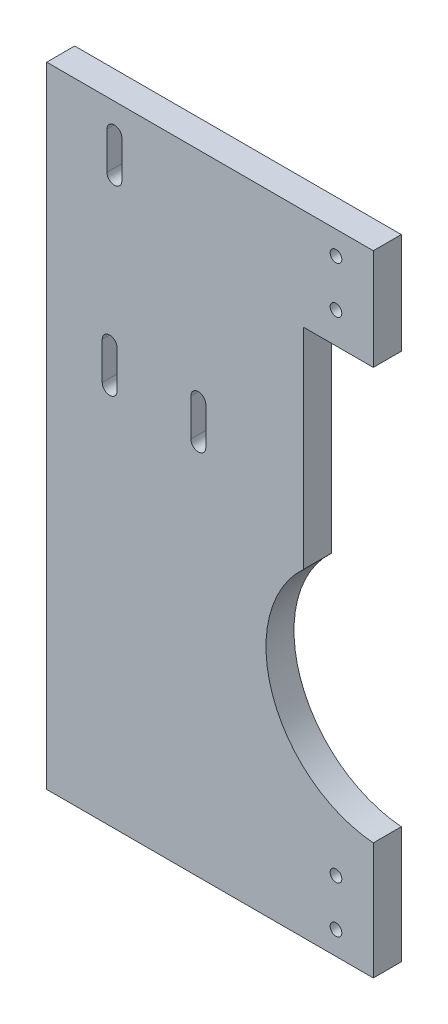
ISO-10303-21;
HEADER;
FILE_DESCRIPTION(('STEP AP214'),'2;1');
FILE_NAME('part.step','',(''),(''),'','','');
FILE_SCHEMA(('AUTOMOTIVE_DESIGN { 1 0 10303 214 1 1 1 1 }'));
ENDSEC;
DATA;
#1=APPLICATION_CONTEXT('core data for automotive mechanical design processes');
#2=APPLICATION_PROTOCOL_DEFINITION('international standard','automotive_design',2000,#1);
#3=PRODUCT_CONTEXT('',#1,'mechanical');
#4=PRODUCT('Part','Part','',(#3));
#5=PRODUCT_RELATED_PRODUCT_CATEGORY('part','',(#4));
#6=PRODUCT_DEFINITION_FORMATION('','',#4);
#7=PRODUCT_DEFINITION_CONTEXT('part definition',#1,'design');
#8=PRODUCT_DEFINITION('design','',#6,#7);
#9=PRODUCT_DEFINITION_SHAPE('','',#8);
#10=(LENGTH_UNIT() NAMED_UNIT(*) SI_UNIT(.MILLI.,.METRE.));
#11=(NAMED_UNIT(*) PLANE_ANGLE_UNIT() SI_UNIT($,.RADIAN.));
#12=(NAMED_UNIT(*) SI_UNIT($,.STERADIAN.) SOLID_ANGLE_UNIT());
#13=UNCERTAINTY_MEASURE_WITH_UNIT(LENGTH_MEASURE(1.E-05),#10,'distance_accuracy_value','');
#14=(GEOMETRIC_REPRESENTATION_CONTEXT(3) GLOBAL_UNCERTAINTY_ASSIGNED_CONTEXT((#13)) GLOBAL_UNIT_ASSIGNED_CONTEXT((#10,
#11,#12)) REPRESENTATION_CONTEXT('',''));
#15=CARTESIAN_POINT('',(0.,0.,0.));
#16=DIRECTION('',(0.,0.,1.));
#17=DIRECTION('',(1.,0.,0.));
#18=AXIS2_PLACEMENT_3D('',#15,#16,#17);
#19=CARTESIAN_POINT('',(70.,0.,6.));
#20=DIRECTION('',(-1.,0.,0.));
#21=DIRECTION('',(0.,0.,1.));
#22=AXIS2_PLACEMENT_3D('',#19,#20,#21);
#23=PLANE('',#22);
#24=DIRECTION('',(0.,1.,0.));
#25=VECTOR('',#24,1.);
#26=CARTESIAN_POINT('',(70.,0.,0.));
#27=LINE('',#26,#25);
#28=CARTESIAN_POINT('',(70.,0.,0.));
#29=VERTEX_POINT('',#28);
#30=CARTESIAN_POINT('',(70.,25.0801284112458,0.));
#31=VERTEX_POINT('',#30);
#32=EDGE_CURVE('E354',#29,#31,#27,.T.);
#33=ORIENTED_EDGE('',*,*,#32,.T.);
#34=DIRECTION('',(0.,0.,1.));
#35=VECTOR('',#34,1.);
#36=CARTESIAN_POINT('',(70.,25.0801284112458,0.));
#37=LINE('',#36,#35);
#38=CARTESIAN_POINT('',(70.,25.0801284112458,6.));
#39=VERTEX_POINT('',#38);
#40=EDGE_CURVE('E380',#31,#39,#37,.T.);
#41=ORIENTED_EDGE('',*,*,#40,.T.);
#42=DIRECTION('',(0.,1.,0.));
#43=VECTOR('',#42,1.);
#44=CARTESIAN_POINT('',(70.,0.,6.));
#45=LINE('',#44,#43);
#46=CARTESIAN_POINT('',(70.,0.,6.));
#47=VERTEX_POINT('',#46);
#48=EDGE_CURVE('E440',#47,#39,#45,.T.);
#49=ORIENTED_EDGE('',*,*,#48,.F.);
#50=DIRECTION('',(0.,0.,-1.));
#51=VECTOR('',#50,1.);
#52=CARTESIAN_POINT('',(70.,0.,6.));
#53=LINE('',#52,#51);
#54=EDGE_CURVE('E496',#47,#29,#53,.T.);
#55=ORIENTED_EDGE('',*,*,#54,.T.);
#56=EDGE_LOOP('',(#33,#41,#49,#55));
#57=FACE_BOUND('',#56,.T.);
#58=ADVANCED_FACE('F38',(#57),#23,.F.);
#59=CARTESIAN_POINT('',(0.,0.,6.));
#60=DIRECTION('',(0.,0.,-1.));
#61=DIRECTION('',(-1.,0.,0.));
#62=AXIS2_PLACEMENT_3D('',#59,#60,#61);
#63=PLANE('',#62);
#64=DIRECTION('',(0.,1.,0.));
#65=VECTOR('',#64,1.);
#66=CARTESIAN_POINT('',(30.9,88.5,6.));
#67=LINE('',#66,#65);
#68=CARTESIAN_POINT('',(30.9,80.5,6.));
#69=VERTEX_POINT('',#68);
#70=CARTESIAN_POINT('',(30.9,88.5,6.));
#71=VERTEX_POINT('',#70);
#72=EDGE_CURVE('E183',#69,#71,#67,.T.);
#73=ORIENTED_EDGE('',*,*,#72,.T.);
#74=CARTESIAN_POINT('',(32.5,88.5,6.));
#75=DIRECTION('',(0.,0.,-1.));
#76=DIRECTION('',(-1.,0.,0.));
#77=AXIS2_PLACEMENT_3D('',#74,#75,#76);
#78=CIRCLE('',#77,1.6);
#79=CARTESIAN_POINT('',(34.1,88.5,6.));
#80=VERTEX_POINT('',#79);
#81=EDGE_CURVE('E177',#71,#80,#78,.T.);
#82=ORIENTED_EDGE('',*,*,#81,.T.);
#83=DIRECTION('',(0.,-1.,0.));
#84=VECTOR('',#83,1.);
#85=CARTESIAN_POINT('',(34.1,88.5,6.));
#86=LINE('',#85,#84);
#87=CARTESIAN_POINT('',(34.1,80.5,6.));
#88=VERTEX_POINT('',#87);
#89=EDGE_CURVE('E186',#80,#88,#86,.T.);
#90=ORIENTED_EDGE('',*,*,#89,.T.);
#91=CARTESIAN_POINT('',(32.5,80.5,6.));
#92=DIRECTION('',(0.,0.,-1.));
#93=DIRECTION('',(-1.,0.,0.));
#94=AXIS2_PLACEMENT_3D('',#91,#92,#93);
#95=CIRCLE('',#94,1.6);
#96=EDGE_CURVE('E53',#88,#69,#95,.T.);
#97=ORIENTED_EDGE('',*,*,#96,.T.);
#98=EDGE_LOOP('',(#73,#82,#90,#97));
#99=FACE_BOUND('',#98,.T.);
#100=DIRECTION('',(0.,1.,0.));
#101=VECTOR('',#100,1.);
#102=CARTESIAN_POINT('',(11.9,89.5,6.));
#103=LINE('',#102,#101);
#104=CARTESIAN_POINT('',(11.9,81.5,6.));
#105=VERTEX_POINT('',#104);
#106=CARTESIAN_POINT('',(11.9,89.5,6.));
#107=VERTEX_POINT('',#106);
#108=EDGE_CURVE('E257',#105,#107,#103,.T.);
#109=ORIENTED_EDGE('',*,*,#108,.T.);
#110=CARTESIAN_POINT('',(13.5,89.5,6.));
#111=DIRECTION('',(0.,0.,-1.));
#112=DIRECTION('',(-1.,0.,0.));
#113=AXIS2_PLACEMENT_3D('',#110,#111,#112);
#114=CIRCLE('',#113,1.6);
#115=CARTESIAN_POINT('',(15.1,89.5,6.));
#116=VERTEX_POINT('',#115);
#117=EDGE_CURVE('E239',#107,#116,#114,.T.);
#118=ORIENTED_EDGE('',*,*,#117,.T.);
#119=DIRECTION('',(0.,-1.,0.));
#120=VECTOR('',#119,1.);
#121=CARTESIAN_POINT('',(15.1,89.5,6.));
#122=LINE('',#121,#120);
#123=CARTESIAN_POINT('',(15.1,81.5,6.));
#124=VERTEX_POINT('',#123);
#125=EDGE_CURVE('E244',#116,#124,#122,.T.);
#126=ORIENTED_EDGE('',*,*,#125,.T.);
#127=CARTESIAN_POINT('',(13.5,81.5,6.));
#128=DIRECTION('',(0.,0.,-1.));
#129=DIRECTION('',(-1.,0.,0.));
#130=AXIS2_PLACEMENT_3D('',#127,#128,#129);
#131=CIRCLE('',#130,1.6);
#132=EDGE_CURVE('E253',#124,#105,#131,.T.);
#133=ORIENTED_EDGE('',*,*,#132,.T.);
#134=EDGE_LOOP('',(#109,#118,#126,#133));
#135=FACE_BOUND('',#134,.T.);
#136=DIRECTION('',(0.,1.,0.));
#137=VECTOR('',#136,1.);
#138=CARTESIAN_POINT('',(12.9,129.,6.));
#139=LINE('',#138,#137);
#140=CARTESIAN_POINT('',(12.9,121.,6.));
#141=VERTEX_POINT('',#140);
#142=CARTESIAN_POINT('',(12.9,129.,6.));
#143=VERTEX_POINT('',#142);
#144=EDGE_CURVE('E307',#141,#143,#139,.T.);
#145=ORIENTED_EDGE('',*,*,#144,.T.);
#146=CARTESIAN_POINT('',(14.5,129.,6.));
#147=DIRECTION('',(0.,0.,-1.));
#148=DIRECTION('',(-1.,0.,0.));
#149=AXIS2_PLACEMENT_3D('',#146,#147,#148);
#150=CIRCLE('',#149,1.6);
#151=CARTESIAN_POINT('',(16.1,129.,6.));
#152=VERTEX_POINT('',#151);
#153=EDGE_CURVE('E289',#143,#152,#150,.T.);
#154=ORIENTED_EDGE('',*,*,#153,.T.);
#155=DIRECTION('',(0.,-1.,0.));
#156=VECTOR('',#155,1.);
#157=CARTESIAN_POINT('',(16.1,129.,6.));
#158=LINE('',#157,#156);
#159=CARTESIAN_POINT('',(16.1,121.,6.));
#160=VERTEX_POINT('',#159);
#161=EDGE_CURVE('E294',#152,#160,#158,.T.);
#162=ORIENTED_EDGE('',*,*,#161,.T.);
#163=CARTESIAN_POINT('',(14.5,121.,6.));
#164=DIRECTION('',(0.,0.,-1.));
#165=DIRECTION('',(-1.,0.,0.));
#166=AXIS2_PLACEMENT_3D('',#163,#164,#165);
#167=CIRCLE('',#166,1.6);
#168=EDGE_CURVE('E303',#160,#141,#167,.T.);
#169=ORIENTED_EDGE('',*,*,#168,.T.);
#170=EDGE_LOOP('',(#145,#154,#162,#169));
#171=FACE_BOUND('',#170,.T.);
#172=CARTESIAN_POINT('',(62.,120.,6.));
#173=DIRECTION('',(0.,0.,1.));
#174=DIRECTION('',(-1.,0.,0.));
#175=AXIS2_PLACEMENT_3D('',#172,#173,#174);
#176=CIRCLE('',#175,1.24999999999998);
#177=CARTESIAN_POINT('',(60.75,120.,6.));
#178=VERTEX_POINT('',#177);
#179=EDGE_CURVE('E413',#178,#178,#176,.T.);
#180=ORIENTED_EDGE('',*,*,#179,.F.);
#181=EDGE_LOOP('',(#180));
#182=FACE_BOUND('',#181,.T.);
#183=CARTESIAN_POINT('',(62.,5.,6.));
#184=DIRECTION('',(0.,0.,1.));
#185=DIRECTION('',(1.,0.,0.));
#186=AXIS2_PLACEMENT_3D('',#183,#184,#185);
#187=CIRCLE('',#186,1.24999999999999);
#188=CARTESIAN_POINT('',(63.25,5.,6.));
#189=VERTEX_POINT('',#188);
#190=EDGE_CURVE('E450',#189,#189,#187,.T.);
#191=ORIENTED_EDGE('',*,*,#190,.F.);
#192=EDGE_LOOP('',(#191));
#193=FACE_BOUND('',#192,.T.);
#194=ORIENTED_EDGE('',*,*,#48,.T.);
#195=CARTESIAN_POINT('',(72.,50.,6.));
#196=DIRECTION('',(0.,0.,1.));
#197=DIRECTION('',(-1.,0.,0.));
#198=AXIS2_PLACEMENT_3D('',#195,#196,#197);
#199=CIRCLE('',#198,25.);
#200=CARTESIAN_POINT('',(55.,68.3303027798234,6.));
#201=VERTEX_POINT('',#200);
#202=EDGE_CURVE('E332',#201,#39,#199,.T.);
#203=ORIENTED_EDGE('',*,*,#202,.F.);
#204=DIRECTION('',(0.,-1.,0.));
#205=VECTOR('',#204,1.);
#206=CARTESIAN_POINT('',(55.,113.330302779823,6.));
#207=LINE('',#206,#205);
#208=CARTESIAN_POINT('',(55.,113.330302779823,6.));
#209=VERTEX_POINT('',#208);
#210=EDGE_CURVE('E345',#209,#201,#207,.T.);
#211=ORIENTED_EDGE('',*,*,#210,.F.);
#212=DIRECTION('',(-1.,0.,0.));
#213=VECTOR('',#212,1.);
#214=CARTESIAN_POINT('',(70.,113.330302779823,6.));
#215=LINE('',#214,#213);
#216=CARTESIAN_POINT('',(70.,113.330302779823,6.));
#217=VERTEX_POINT('',#216);
#218=EDGE_CURVE('E384',#217,#209,#215,.T.);
#219=ORIENTED_EDGE('',*,*,#218,.F.);
#220=CARTESIAN_POINT('',(70.,135.,6.));
#221=VERTEX_POINT('',#220);
#222=EDGE_CURVE('E445',#217,#221,#45,.T.);
#223=ORIENTED_EDGE('',*,*,#222,.T.);
#224=DIRECTION('',(-1.,0.,0.));
#225=VECTOR('',#224,1.);
#226=CARTESIAN_POINT('',(0.,135.,6.));
#227=LINE('',#226,#225);
#228=CARTESIAN_POINT('',(0.,135.,6.));
#229=VERTEX_POINT('',#228);
#230=EDGE_CURVE('E437',#221,#229,#227,.T.);
#231=ORIENTED_EDGE('',*,*,#230,.T.);
#232=DIRECTION('',(0.,-1.,0.));
#233=VECTOR('',#232,1.);
#234=CARTESIAN_POINT('',(0.,0.,6.));
#235=LINE('',#234,#233);
#236=CARTESIAN_POINT('',(0.,0.,6.));
#237=VERTEX_POINT('',#236);
#238=EDGE_CURVE('E434',#229,#237,#235,.T.);
#239=ORIENTED_EDGE('',*,*,#238,.T.);
#240=DIRECTION('',(1.,0.,0.));
#241=VECTOR('',#240,1.);
#242=CARTESIAN_POINT('',(0.,0.,6.));
#243=LINE('',#242,#241);
#244=EDGE_CURVE('E362',#237,#47,#243,.T.);
#245=ORIENTED_EDGE('',*,*,#244,.T.);
#246=EDGE_LOOP('',(#194,#203,#211,#219,#223,#231,#239,#245));
#247=FACE_BOUND('',#246,.T.);
#248=CARTESIAN_POINT('',(62.,15.,6.));
#249=DIRECTION('',(0.,0.,1.));
#250=DIRECTION('',(1.,0.,0.));
#251=AXIS2_PLACEMENT_3D('',#248,#249,#250);
#252=CIRCLE('',#251,1.24999999999998);
#253=CARTESIAN_POINT('',(63.25,15.,6.));
#254=VERTEX_POINT('',#253);
#255=EDGE_CURVE('E422',#254,#254,#252,.T.);
#256=ORIENTED_EDGE('',*,*,#255,.F.);
#257=EDGE_LOOP('',(#256));
#258=FACE_BOUND('',#257,.T.);
#259=CARTESIAN_POINT('',(62.,130.,6.));
#260=DIRECTION('',(0.,0.,1.));
#261=DIRECTION('',(-1.,0.,0.));
#262=AXIS2_PLACEMENT_3D('',#259,#260,#261);
#263=CIRCLE('',#262,1.24999999999999);
#264=CARTESIAN_POINT('',(60.75,130.,6.));
#265=VERTEX_POINT('',#264);
#266=EDGE_CURVE('E405',#265,#265,#263,.T.);
#267=ORIENTED_EDGE('',*,*,#266,.F.);
#268=EDGE_LOOP('',(#267));
#269=FACE_BOUND('',#268,.T.);
#270=ADVANCED_FACE('F191',(#99,#135,#171,#182,#193,#247,#258,#269),#63,.F.);
#271=CARTESIAN_POINT('',(0.,0.,0.));
#272=DIRECTION('',(0.,0.,-1.));
#273=DIRECTION('',(-1.,0.,0.));
#274=AXIS2_PLACEMENT_3D('',#271,#272,#273);
#275=PLANE('',#274);
#276=CARTESIAN_POINT('',(32.5,88.5,0.));
#277=DIRECTION('',(0.,0.,-1.));
#278=DIRECTION('',(-1.,0.,0.));
#279=AXIS2_PLACEMENT_3D('',#276,#277,#278);
#280=CIRCLE('',#279,1.6);
#281=CARTESIAN_POINT('',(30.9,88.5,0.));
#282=VERTEX_POINT('',#281);
#283=CARTESIAN_POINT('',(34.1,88.5,0.));
#284=VERTEX_POINT('',#283);
#285=EDGE_CURVE('E61',#282,#284,#280,.T.);
#286=ORIENTED_EDGE('',*,*,#285,.F.);
#287=DIRECTION('',(0.,1.,0.));
#288=VECTOR('',#287,1.);
#289=CARTESIAN_POINT('',(30.9,88.5,0.));
#290=LINE('',#289,#288);
#291=CARTESIAN_POINT('',(30.9,80.5,0.));
#292=VERTEX_POINT('',#291);
#293=EDGE_CURVE('E195',#292,#282,#290,.T.);
#294=ORIENTED_EDGE('',*,*,#293,.F.);
#295=CARTESIAN_POINT('',(32.5,80.5,0.));
#296=DIRECTION('',(0.,0.,-1.));
#297=DIRECTION('',(-1.,0.,0.));
#298=AXIS2_PLACEMENT_3D('',#295,#296,#297);
#299=CIRCLE('',#298,1.6);
#300=CARTESIAN_POINT('',(34.1,80.5,0.));
#301=VERTEX_POINT('',#300);
#302=EDGE_CURVE('E200',#301,#292,#299,.T.);
#303=ORIENTED_EDGE('',*,*,#302,.F.);
#304=DIRECTION('',(0.,-1.,0.));
#305=VECTOR('',#304,1.);
#306=CARTESIAN_POINT('',(34.1,88.5,0.));
#307=LINE('',#306,#305);
#308=EDGE_CURVE('E220',#284,#301,#307,.T.);
#309=ORIENTED_EDGE('',*,*,#308,.F.);
#310=EDGE_LOOP('',(#286,#294,#303,#309));
#311=FACE_BOUND('',#310,.T.);
#312=CARTESIAN_POINT('',(13.5,89.5,0.));
#313=DIRECTION('',(0.,0.,-1.));
#314=DIRECTION('',(-1.,0.,0.));
#315=AXIS2_PLACEMENT_3D('',#312,#313,#314);
#316=CIRCLE('',#315,1.6);
#317=CARTESIAN_POINT('',(11.9,89.5,0.));
#318=VERTEX_POINT('',#317);
#319=CARTESIAN_POINT('',(15.1,89.5,0.));
#320=VERTEX_POINT('',#319);
#321=EDGE_CURVE('E235',#318,#320,#316,.T.);
#322=ORIENTED_EDGE('',*,*,#321,.F.);
#323=DIRECTION('',(0.,1.,0.));
#324=VECTOR('',#323,1.);
#325=CARTESIAN_POINT('',(11.9,89.5,0.));
#326=LINE('',#325,#324);
#327=CARTESIAN_POINT('',(11.9,81.5,0.));
#328=VERTEX_POINT('',#327);
#329=EDGE_CURVE('E245',#328,#318,#326,.T.);
#330=ORIENTED_EDGE('',*,*,#329,.F.);
#331=CARTESIAN_POINT('',(13.5,81.5,0.));
#332=DIRECTION('',(0.,0.,-1.));
#333=DIRECTION('',(-1.,0.,0.));
#334=AXIS2_PLACEMENT_3D('',#331,#332,#333);
#335=CIRCLE('',#334,1.6);
#336=CARTESIAN_POINT('',(15.1,81.5,0.));
#337=VERTEX_POINT('',#336);
#338=EDGE_CURVE('E278',#337,#328,#335,.T.);
#339=ORIENTED_EDGE('',*,*,#338,.F.);
#340=DIRECTION('',(0.,-1.,0.));
#341=VECTOR('',#340,1.);
#342=CARTESIAN_POINT('',(15.1,89.5,0.));
#343=LINE('',#342,#341);
#344=EDGE_CURVE('E266',#320,#337,#343,.T.);
#345=ORIENTED_EDGE('',*,*,#344,.F.);
#346=EDGE_LOOP('',(#322,#330,#339,#345));
#347=FACE_BOUND('',#346,.T.);
#348=CARTESIAN_POINT('',(14.5,129.,0.));
#349=DIRECTION('',(0.,0.,-1.));
#350=DIRECTION('',(-1.,0.,0.));
#351=AXIS2_PLACEMENT_3D('',#348,#349,#350);
#352=CIRCLE('',#351,1.6);
#353=CARTESIAN_POINT('',(12.9,129.,0.));
#354=VERTEX_POINT('',#353);
#355=CARTESIAN_POINT('',(16.1,129.,0.));
#356=VERTEX_POINT('',#355);
#357=EDGE_CURVE('E282',#354,#356,#352,.T.);
#358=ORIENTED_EDGE('',*,*,#357,.F.);
#359=DIRECTION('',(0.,1.,0.));
#360=VECTOR('',#359,1.);
#361=CARTESIAN_POINT('',(12.9,129.,0.));
#362=LINE('',#361,#360);
#363=CARTESIAN_POINT('',(12.9,121.,0.));
#364=VERTEX_POINT('',#363);
#365=EDGE_CURVE('E295',#364,#354,#362,.T.);
#366=ORIENTED_EDGE('',*,*,#365,.F.);
#367=CARTESIAN_POINT('',(14.5,121.,0.));
#368=DIRECTION('',(0.,0.,-1.));
#369=DIRECTION('',(-1.,0.,0.));
#370=AXIS2_PLACEMENT_3D('',#367,#368,#369);
#371=CIRCLE('',#370,1.6);
#372=CARTESIAN_POINT('',(16.1,121.,0.));
#373=VERTEX_POINT('',#372);
#374=EDGE_CURVE('E328',#373,#364,#371,.T.);
#375=ORIENTED_EDGE('',*,*,#374,.F.);
#376=DIRECTION('',(0.,-1.,0.));
#377=VECTOR('',#376,1.);
#378=CARTESIAN_POINT('',(16.1,129.,0.));
#379=LINE('',#378,#377);
#380=EDGE_CURVE('E316',#356,#373,#379,.T.);
#381=ORIENTED_EDGE('',*,*,#380,.F.);
#382=EDGE_LOOP('',(#358,#366,#375,#381));
#383=FACE_BOUND('',#382,.T.);
#384=CARTESIAN_POINT('',(72.,50.,0.));
#385=DIRECTION('',(0.,0.,1.));
#386=DIRECTION('',(-1.,0.,0.));
#387=AXIS2_PLACEMENT_3D('',#384,#385,#386);
#388=CIRCLE('',#387,25.);
#389=CARTESIAN_POINT('',(55.,68.3303027798234,0.));
#390=VERTEX_POINT('',#389);
#391=EDGE_CURVE('E339',#390,#31,#388,.T.);
#392=ORIENTED_EDGE('',*,*,#391,.T.);
#393=ORIENTED_EDGE('',*,*,#32,.F.);
#394=DIRECTION('',(1.,0.,0.));
#395=VECTOR('',#394,1.);
#396=CARTESIAN_POINT('',(0.,0.,0.));
#397=LINE('',#396,#395);
#398=CARTESIAN_POINT('',(0.,0.,0.));
#399=VERTEX_POINT('',#398);
#400=EDGE_CURVE('E485',#399,#29,#397,.T.);
#401=ORIENTED_EDGE('',*,*,#400,.F.);
#402=DIRECTION('',(0.,-1.,0.));
#403=VECTOR('',#402,1.);
#404=CARTESIAN_POINT('',(0.,0.,0.));
#405=LINE('',#404,#403);
#406=CARTESIAN_POINT('',(0.,135.,0.));
#407=VERTEX_POINT('',#406);
#408=EDGE_CURVE('E471',#407,#399,#405,.T.);
#409=ORIENTED_EDGE('',*,*,#408,.F.);
#410=DIRECTION('',(-1.,0.,0.));
#411=VECTOR('',#410,1.);
#412=CARTESIAN_POINT('',(0.,135.,0.));
#413=LINE('',#412,#411);
#414=CARTESIAN_POINT('',(70.,135.,0.));
#415=VERTEX_POINT('',#414);
#416=EDGE_CURVE('E360',#415,#407,#413,.T.);
#417=ORIENTED_EDGE('',*,*,#416,.F.);
#418=CARTESIAN_POINT('',(70.,113.330302779823,0.));
#419=VERTEX_POINT('',#418);
#420=EDGE_CURVE('E361',#419,#415,#27,.T.);
#421=ORIENTED_EDGE('',*,*,#420,.F.);
#422=DIRECTION('',(-1.,0.,0.));
#423=VECTOR('',#422,1.);
#424=CARTESIAN_POINT('',(70.,113.330302779823,0.));
#425=LINE('',#424,#423);
#426=CARTESIAN_POINT('',(55.,113.330302779823,0.));
#427=VERTEX_POINT('',#426);
#428=EDGE_CURVE('E344',#419,#427,#425,.T.);
#429=ORIENTED_EDGE('',*,*,#428,.T.);
#430=DIRECTION('',(0.,-1.,0.));
#431=VECTOR('',#430,1.);
#432=CARTESIAN_POINT('',(55.,113.330302779823,0.));
#433=LINE('',#432,#431);
#434=EDGE_CURVE('E375',#427,#390,#433,.T.);
#435=ORIENTED_EDGE('',*,*,#434,.T.);
#436=EDGE_LOOP('',(#392,#393,#401,#409,#417,#421,#429,#435));
#437=FACE_BOUND('',#436,.T.);
#438=CARTESIAN_POINT('',(62.,120.,0.));
#439=DIRECTION('',(0.,0.,1.));
#440=DIRECTION('',(-1.,0.,0.));
#441=AXIS2_PLACEMENT_3D('',#438,#439,#440);
#442=CIRCLE('',#441,1.24999999999998);
#443=CARTESIAN_POINT('',(60.75,120.,0.));
#444=VERTEX_POINT('',#443);
#445=EDGE_CURVE('E409',#444,#444,#442,.T.);
#446=ORIENTED_EDGE('',*,*,#445,.T.);
#447=EDGE_LOOP('',(#446));
#448=FACE_BOUND('',#447,.T.);
#449=CARTESIAN_POINT('',(62.,5.,0.));
#450=DIRECTION('',(0.,0.,1.));
#451=DIRECTION('',(1.,0.,0.));
#452=AXIS2_PLACEMENT_3D('',#449,#450,#451);
#453=CIRCLE('',#452,1.24999999999999);
#454=CARTESIAN_POINT('',(63.25,5.,0.));
#455=VERTEX_POINT('',#454);
#456=EDGE_CURVE('E427',#455,#455,#453,.T.);
#457=ORIENTED_EDGE('',*,*,#456,.T.);
#458=EDGE_LOOP('',(#457));
#459=FACE_BOUND('',#458,.T.);
#460=CARTESIAN_POINT('',(62.,15.,0.));
#461=DIRECTION('',(0.,0.,1.));
#462=DIRECTION('',(1.,0.,0.));
#463=AXIS2_PLACEMENT_3D('',#460,#461,#462);
#464=CIRCLE('',#463,1.24999999999998);
#465=CARTESIAN_POINT('',(63.25,15.,0.));
#466=VERTEX_POINT('',#465);
#467=EDGE_CURVE('E417',#466,#466,#464,.T.);
#468=ORIENTED_EDGE('',*,*,#467,.T.);
#469=EDGE_LOOP('',(#468));
#470=FACE_BOUND('',#469,.T.);
#471=CARTESIAN_POINT('',(62.,130.,0.));
#472=DIRECTION('',(0.,0.,1.));
#473=DIRECTION('',(-1.,0.,0.));
#474=AXIS2_PLACEMENT_3D('',#471,#472,#473);
#475=CIRCLE('',#474,1.24999999999999);
#476=CARTESIAN_POINT('',(60.75,130.,0.));
#477=VERTEX_POINT('',#476);
#478=EDGE_CURVE('E399',#477,#477,#475,.T.);
#479=ORIENTED_EDGE('',*,*,#478,.T.);
#480=EDGE_LOOP('',(#479));
#481=FACE_BOUND('',#480,.T.);
#482=ADVANCED_FACE('F468',(#311,#347,#383,#437,#448,#459,#470,#481),#275,.T.);
#483=ORIENTED_EDGE('',*,*,#222,.F.);
#484=DIRECTION('',(0.,0.,1.));
#485=VECTOR('',#484,1.);
#486=CARTESIAN_POINT('',(70.,113.330302779823,0.));
#487=LINE('',#486,#485);
#488=EDGE_CURVE('E402',#419,#217,#487,.T.);
#489=ORIENTED_EDGE('',*,*,#488,.F.);
#490=ORIENTED_EDGE('',*,*,#420,.T.);
#491=DIRECTION('',(0.,0.,-1.));
#492=VECTOR('',#491,1.);
#493=CARTESIAN_POINT('',(70.,135.,6.));
#494=LINE('',#493,#492);
#495=EDGE_CURVE('E12',#221,#415,#494,.T.);
#496=ORIENTED_EDGE('',*,*,#495,.F.);
#497=EDGE_LOOP('',(#483,#489,#490,#496));
#498=FACE_BOUND('',#497,.T.);
#499=ADVANCED_FACE('F40',(#498),#23,.F.);
#500=CARTESIAN_POINT('',(0.,135.,6.));
#501=DIRECTION('',(0.,-1.,0.));
#502=DIRECTION('',(0.,0.,-1.));
#503=AXIS2_PLACEMENT_3D('',#500,#501,#502);
#504=PLANE('',#503);
#505=ORIENTED_EDGE('',*,*,#416,.T.);
#506=DIRECTION('',(0.,0.,-1.));
#507=VECTOR('',#506,1.);
#508=CARTESIAN_POINT('',(0.,135.,6.));
#509=LINE('',#508,#507);
#510=EDGE_CURVE('E46',#229,#407,#509,.T.);
#511=ORIENTED_EDGE('',*,*,#510,.F.);
#512=ORIENTED_EDGE('',*,*,#230,.F.);
#513=ORIENTED_EDGE('',*,*,#495,.T.);
#514=EDGE_LOOP('',(#505,#511,#512,#513));
#515=FACE_BOUND('',#514,.T.);
#516=ADVANCED_FACE('F476',(#515),#504,.F.);
#517=CARTESIAN_POINT('',(0.,0.,6.));
#518=DIRECTION('',(1.,0.,0.));
#519=DIRECTION('',(0.,0.,-1.));
#520=AXIS2_PLACEMENT_3D('',#517,#518,#519);
#521=PLANE('',#520);
#522=ORIENTED_EDGE('',*,*,#408,.T.);
#523=DIRECTION('',(0.,0.,-1.));
#524=VECTOR('',#523,1.);
#525=CARTESIAN_POINT('',(0.,0.,6.));
#526=LINE('',#525,#524);
#527=EDGE_CURVE('E498',#237,#399,#526,.T.);
#528=ORIENTED_EDGE('',*,*,#527,.F.);
#529=ORIENTED_EDGE('',*,*,#238,.F.);
#530=ORIENTED_EDGE('',*,*,#510,.T.);
#531=EDGE_LOOP('',(#522,#528,#529,#530));
#532=FACE_BOUND('',#531,.T.);
#533=ADVANCED_FACE('F500',(#532),#521,.F.);
#534=CARTESIAN_POINT('',(0.,0.,6.));
#535=DIRECTION('',(0.,1.,0.));
#536=DIRECTION('',(0.,0.,1.));
#537=AXIS2_PLACEMENT_3D('',#534,#535,#536);
#538=PLANE('',#537);
#539=ORIENTED_EDGE('',*,*,#400,.T.);
#540=ORIENTED_EDGE('',*,*,#54,.F.);
#541=ORIENTED_EDGE('',*,*,#244,.F.);
#542=ORIENTED_EDGE('',*,*,#527,.T.);
#543=EDGE_LOOP('',(#539,#540,#541,#542));
#544=FACE_BOUND('',#543,.T.);
#545=ADVANCED_FACE('F502',(#544),#538,.F.);
#546=CARTESIAN_POINT('',(62.,5.,6.));
#547=DIRECTION('',(0.,0.,-1.));
#548=DIRECTION('',(-1.,0.,0.));
#549=AXIS2_PLACEMENT_3D('',#546,#547,#548);
#550=CYLINDRICAL_SURFACE('',#549,1.24999999999999);
#551=ORIENTED_EDGE('',*,*,#190,.T.);
#552=EDGE_LOOP('',(#551));
#553=FACE_BOUND('',#552,.T.);
#554=ORIENTED_EDGE('',*,*,#456,.F.);
#555=EDGE_LOOP('',(#554));
#556=FACE_BOUND('',#555,.T.);
#557=ADVANCED_FACE('F584',(#553,#556),#550,.F.);
#558=CARTESIAN_POINT('',(62.,15.,6.));
#559=DIRECTION('',(0.,0.,-1.));
#560=DIRECTION('',(-1.,0.,0.));
#561=AXIS2_PLACEMENT_3D('',#558,#559,#560);
#562=CYLINDRICAL_SURFACE('',#561,1.24999999999998);
#563=ORIENTED_EDGE('',*,*,#255,.T.);
#564=EDGE_LOOP('',(#563));
#565=FACE_BOUND('',#564,.T.);
#566=ORIENTED_EDGE('',*,*,#467,.F.);
#567=EDGE_LOOP('',(#566));
#568=FACE_BOUND('',#567,.T.);
#569=ADVANCED_FACE('F581',(#565,#568),#562,.F.);
#570=CARTESIAN_POINT('',(62.,120.,6.));
#571=DIRECTION('',(0.,0.,-1.));
#572=DIRECTION('',(-1.,0.,0.));
#573=AXIS2_PLACEMENT_3D('',#570,#571,#572);
#574=CYLINDRICAL_SURFACE('',#573,1.24999999999998);
#575=ORIENTED_EDGE('',*,*,#179,.T.);
#576=EDGE_LOOP('',(#575));
#577=FACE_BOUND('',#576,.T.);
#578=ORIENTED_EDGE('',*,*,#445,.F.);
#579=EDGE_LOOP('',(#578));
#580=FACE_BOUND('',#579,.T.);
#581=ADVANCED_FACE('F583',(#577,#580),#574,.F.);
#582=CARTESIAN_POINT('',(62.,130.,6.));
#583=DIRECTION('',(0.,0.,-1.));
#584=DIRECTION('',(-1.,0.,0.));
#585=AXIS2_PLACEMENT_3D('',#582,#583,#584);
#586=CYLINDRICAL_SURFACE('',#585,1.24999999999999);
#587=ORIENTED_EDGE('',*,*,#266,.T.);
#588=EDGE_LOOP('',(#587));
#589=FACE_BOUND('',#588,.T.);
#590=ORIENTED_EDGE('',*,*,#478,.F.);
#591=EDGE_LOOP('',(#590));
#592=FACE_BOUND('',#591,.T.);
#593=ADVANCED_FACE('F591',(#589,#592),#586,.F.);
#594=CARTESIAN_POINT('',(72.,50.,0.));
#595=DIRECTION('',(0.,0.,1.));
#596=DIRECTION('',(1.,0.,0.));
#597=AXIS2_PLACEMENT_3D('',#594,#595,#596);
#598=CYLINDRICAL_SURFACE('',#597,25.);
#599=ORIENTED_EDGE('',*,*,#202,.T.);
#600=ORIENTED_EDGE('',*,*,#40,.F.);
#601=ORIENTED_EDGE('',*,*,#391,.F.);
#602=DIRECTION('',(0.,0.,1.));
#603=VECTOR('',#602,1.);
#604=CARTESIAN_POINT('',(55.,68.3303027798234,0.));
#605=LINE('',#604,#603);
#606=EDGE_CURVE('E397',#390,#201,#605,.T.);
#607=ORIENTED_EDGE('',*,*,#606,.T.);
#608=EDGE_LOOP('',(#599,#600,#601,#607));
#609=FACE_BOUND('',#608,.T.);
#610=ADVANCED_FACE('F569',(#609),#598,.F.);
#611=CARTESIAN_POINT('',(55.,113.330302779823,0.));
#612=DIRECTION('',(-1.,0.,0.));
#613=DIRECTION('',(0.,-1.,0.));
#614=AXIS2_PLACEMENT_3D('',#611,#612,#613);
#615=PLANE('',#614);
#616=ORIENTED_EDGE('',*,*,#210,.T.);
#617=ORIENTED_EDGE('',*,*,#606,.F.);
#618=ORIENTED_EDGE('',*,*,#434,.F.);
#619=DIRECTION('',(0.,0.,1.));
#620=VECTOR('',#619,1.);
#621=CARTESIAN_POINT('',(55.,113.330302779823,0.));
#622=LINE('',#621,#620);
#623=EDGE_CURVE('E400',#427,#209,#622,.T.);
#624=ORIENTED_EDGE('',*,*,#623,.T.);
#625=EDGE_LOOP('',(#616,#617,#618,#624));
#626=FACE_BOUND('',#625,.T.);
#627=ADVANCED_FACE('F572',(#626),#615,.F.);
#628=CARTESIAN_POINT('',(70.,113.330302779823,0.));
#629=DIRECTION('',(0.,1.,0.));
#630=DIRECTION('',(0.,0.,1.));
#631=AXIS2_PLACEMENT_3D('',#628,#629,#630);
#632=PLANE('',#631);
#633=ORIENTED_EDGE('',*,*,#218,.T.);
#634=ORIENTED_EDGE('',*,*,#623,.F.);
#635=ORIENTED_EDGE('',*,*,#428,.F.);
#636=ORIENTED_EDGE('',*,*,#488,.T.);
#637=EDGE_LOOP('',(#633,#634,#635,#636));
#638=FACE_BOUND('',#637,.T.);
#639=ADVANCED_FACE('F574',(#638),#632,.F.);
#640=CARTESIAN_POINT('',(14.5,129.,6.));
#641=DIRECTION('',(0.,0.,-1.));
#642=DIRECTION('',(-1.,0.,0.));
#643=AXIS2_PLACEMENT_3D('',#640,#641,#642);
#644=CYLINDRICAL_SURFACE('',#643,1.6);
#645=ORIENTED_EDGE('',*,*,#357,.T.);
#646=DIRECTION('',(0.,0.,-1.));
#647=VECTOR('',#646,1.);
#648=CARTESIAN_POINT('',(16.1,129.,6.));
#649=LINE('',#648,#647);
#650=EDGE_CURVE('E312',#152,#356,#649,.T.);
#651=ORIENTED_EDGE('',*,*,#650,.F.);
#652=ORIENTED_EDGE('',*,*,#153,.F.);
#653=DIRECTION('',(0.,0.,-1.));
#654=VECTOR('',#653,1.);
#655=CARTESIAN_POINT('',(12.9,129.,6.));
#656=LINE('',#655,#654);
#657=EDGE_CURVE('E330',#143,#354,#656,.T.);
#658=ORIENTED_EDGE('',*,*,#657,.T.);
#659=EDGE_LOOP('',(#645,#651,#652,#658));
#660=FACE_BOUND('',#659,.T.);
#661=ADVANCED_FACE('F603',(#660),#644,.F.);
#662=CARTESIAN_POINT('',(12.9,129.,6.));
#663=DIRECTION('',(-1.,0.,0.));
#664=DIRECTION('',(0.,-1.,0.));
#665=AXIS2_PLACEMENT_3D('',#662,#663,#664);
#666=PLANE('',#665);
#667=ORIENTED_EDGE('',*,*,#365,.T.);
#668=ORIENTED_EDGE('',*,*,#657,.F.);
#669=ORIENTED_EDGE('',*,*,#144,.F.);
#670=DIRECTION('',(0.,0.,-1.));
#671=VECTOR('',#670,1.);
#672=CARTESIAN_POINT('',(12.9,121.,6.));
#673=LINE('',#672,#671);
#674=EDGE_CURVE('E333',#141,#364,#673,.T.);
#675=ORIENTED_EDGE('',*,*,#674,.T.);
#676=EDGE_LOOP('',(#667,#668,#669,#675));
#677=FACE_BOUND('',#676,.T.);
#678=ADVANCED_FACE('F608',(#677),#666,.F.);
#679=CARTESIAN_POINT('',(14.5,121.,6.));
#680=DIRECTION('',(0.,0.,-1.));
#681=DIRECTION('',(-1.,0.,0.));
#682=AXIS2_PLACEMENT_3D('',#679,#680,#681);
#683=CYLINDRICAL_SURFACE('',#682,1.6);
#684=ORIENTED_EDGE('',*,*,#374,.T.);
#685=ORIENTED_EDGE('',*,*,#674,.F.);
#686=ORIENTED_EDGE('',*,*,#168,.F.);
#687=DIRECTION('',(0.,0.,-1.));
#688=VECTOR('',#687,1.);
#689=CARTESIAN_POINT('',(16.1,121.,6.));
#690=LINE('',#689,#688);
#691=EDGE_CURVE('E335',#160,#373,#690,.T.);
#692=ORIENTED_EDGE('',*,*,#691,.T.);
#693=EDGE_LOOP('',(#684,#685,#686,#692));
#694=FACE_BOUND('',#693,.T.);
#695=ADVANCED_FACE('F527',(#694),#683,.F.);
#696=CARTESIAN_POINT('',(16.1,129.,6.));
#697=DIRECTION('',(1.,0.,0.));
#698=DIRECTION('',(0.,0.,-1.));
#699=AXIS2_PLACEMENT_3D('',#696,#697,#698);
#700=PLANE('',#699);
#701=ORIENTED_EDGE('',*,*,#380,.T.);
#702=ORIENTED_EDGE('',*,*,#691,.F.);
#703=ORIENTED_EDGE('',*,*,#161,.F.);
#704=ORIENTED_EDGE('',*,*,#650,.T.);
#705=EDGE_LOOP('',(#701,#702,#703,#704));
#706=FACE_BOUND('',#705,.T.);
#707=ADVANCED_FACE('F520',(#706),#700,.F.);
#708=CARTESIAN_POINT('',(13.5,89.5,6.));
#709=DIRECTION('',(0.,0.,-1.));
#710=DIRECTION('',(-1.,0.,0.));
#711=AXIS2_PLACEMENT_3D('',#708,#709,#710);
#712=CYLINDRICAL_SURFACE('',#711,1.6);
#713=ORIENTED_EDGE('',*,*,#321,.T.);
#714=DIRECTION('',(0.,0.,-1.));
#715=VECTOR('',#714,1.);
#716=CARTESIAN_POINT('',(15.1,89.5,6.));
#717=LINE('',#716,#715);
#718=EDGE_CURVE('E262',#116,#320,#717,.T.);
#719=ORIENTED_EDGE('',*,*,#718,.F.);
#720=ORIENTED_EDGE('',*,*,#117,.F.);
#721=DIRECTION('',(0.,0.,-1.));
#722=VECTOR('',#721,1.);
#723=CARTESIAN_POINT('',(11.9,89.5,6.));
#724=LINE('',#723,#722);
#725=EDGE_CURVE('E280',#107,#318,#724,.T.);
#726=ORIENTED_EDGE('',*,*,#725,.T.);
#727=EDGE_LOOP('',(#713,#719,#720,#726));
#728=FACE_BOUND('',#727,.T.);
#729=ADVANCED_FACE('F550',(#728),#712,.F.);
#730=CARTESIAN_POINT('',(11.9,89.5,6.));
#731=DIRECTION('',(-1.,0.,0.));
#732=DIRECTION('',(0.,-1.,0.));
#733=AXIS2_PLACEMENT_3D('',#730,#731,#732);
#734=PLANE('',#733);
#735=ORIENTED_EDGE('',*,*,#329,.T.);
#736=ORIENTED_EDGE('',*,*,#725,.F.);
#737=ORIENTED_EDGE('',*,*,#108,.F.);
#738=DIRECTION('',(0.,0.,-1.));
#739=VECTOR('',#738,1.);
#740=CARTESIAN_POINT('',(11.9,81.5,6.));
#741=LINE('',#740,#739);
#742=EDGE_CURVE('E283',#105,#328,#741,.T.);
#743=ORIENTED_EDGE('',*,*,#742,.T.);
#744=EDGE_LOOP('',(#735,#736,#737,#743));
#745=FACE_BOUND('',#744,.T.);
#746=ADVANCED_FACE('F547',(#745),#734,.F.);
#747=CARTESIAN_POINT('',(13.5,81.5,6.));
#748=DIRECTION('',(0.,0.,-1.));
#749=DIRECTION('',(-1.,0.,0.));
#750=AXIS2_PLACEMENT_3D('',#747,#748,#749);
#751=CYLINDRICAL_SURFACE('',#750,1.6);
#752=ORIENTED_EDGE('',*,*,#338,.T.);
#753=ORIENTED_EDGE('',*,*,#742,.F.);
#754=ORIENTED_EDGE('',*,*,#132,.F.);
#755=DIRECTION('',(0.,0.,-1.));
#756=VECTOR('',#755,1.);
#757=CARTESIAN_POINT('',(15.1,81.5,6.));
#758=LINE('',#757,#756);
#759=EDGE_CURVE('E285',#124,#337,#758,.T.);
#760=ORIENTED_EDGE('',*,*,#759,.T.);
#761=EDGE_LOOP('',(#752,#753,#754,#760));
#762=FACE_BOUND('',#761,.T.);
#763=ADVANCED_FACE('F543',(#762),#751,.F.);
#764=CARTESIAN_POINT('',(15.1,89.5,6.));
#765=DIRECTION('',(1.,0.,0.));
#766=DIRECTION('',(0.,0.,-1.));
#767=AXIS2_PLACEMENT_3D('',#764,#765,#766);
#768=PLANE('',#767);
#769=ORIENTED_EDGE('',*,*,#344,.T.);
#770=ORIENTED_EDGE('',*,*,#759,.F.);
#771=ORIENTED_EDGE('',*,*,#125,.F.);
#772=ORIENTED_EDGE('',*,*,#718,.T.);
#773=EDGE_LOOP('',(#769,#770,#771,#772));
#774=FACE_BOUND('',#773,.T.);
#775=ADVANCED_FACE('F539',(#774),#768,.F.);
#776=CARTESIAN_POINT('',(32.5,88.5,6.));
#777=DIRECTION('',(0.,0.,-1.));
#778=DIRECTION('',(-1.,0.,0.));
#779=AXIS2_PLACEMENT_3D('',#776,#777,#778);
#780=CYLINDRICAL_SURFACE('',#779,1.6);
#781=ORIENTED_EDGE('',*,*,#285,.T.);
#782=DIRECTION('',(0.,0.,-1.));
#783=VECTOR('',#782,1.);
#784=CARTESIAN_POINT('',(34.1,88.5,6.));
#785=LINE('',#784,#783);
#786=EDGE_CURVE('E173',#80,#284,#785,.T.);
#787=ORIENTED_EDGE('',*,*,#786,.F.);
#788=ORIENTED_EDGE('',*,*,#81,.F.);
#789=DIRECTION('',(0.,0.,-1.));
#790=VECTOR('',#789,1.);
#791=CARTESIAN_POINT('',(30.9,88.5,6.));
#792=LINE('',#791,#790);
#793=EDGE_CURVE('E233',#71,#282,#792,.T.);
#794=ORIENTED_EDGE('',*,*,#793,.T.);
#795=EDGE_LOOP('',(#781,#787,#788,#794));
#796=FACE_BOUND('',#795,.T.);
#797=ADVANCED_FACE('F175',(#796),#780,.F.);
#798=CARTESIAN_POINT('',(30.9,88.5,6.));
#799=DIRECTION('',(-1.,0.,0.));
#800=DIRECTION('',(0.,-1.,0.));
#801=AXIS2_PLACEMENT_3D('',#798,#799,#800);
#802=PLANE('',#801);
#803=ORIENTED_EDGE('',*,*,#293,.T.);
#804=ORIENTED_EDGE('',*,*,#793,.F.);
#805=ORIENTED_EDGE('',*,*,#72,.F.);
#806=DIRECTION('',(0.,0.,-1.));
#807=VECTOR('',#806,1.);
#808=CARTESIAN_POINT('',(30.9,80.5,6.));
#809=LINE('',#808,#807);
#810=EDGE_CURVE('E236',#69,#292,#809,.T.);
#811=ORIENTED_EDGE('',*,*,#810,.T.);
#812=EDGE_LOOP('',(#803,#804,#805,#811));
#813=FACE_BOUND('',#812,.T.);
#814=ADVANCED_FACE('F627',(#813),#802,.F.);
#815=CARTESIAN_POINT('',(32.5,80.5,6.));
#816=DIRECTION('',(0.,0.,-1.));
#817=DIRECTION('',(-1.,0.,0.));
#818=AXIS2_PLACEMENT_3D('',#815,#816,#817);
#819=CYLINDRICAL_SURFACE('',#818,1.6);
#820=ORIENTED_EDGE('',*,*,#302,.T.);
#821=ORIENTED_EDGE('',*,*,#810,.F.);
#822=ORIENTED_EDGE('',*,*,#96,.F.);
#823=DIRECTION('',(0.,0.,-1.));
#824=VECTOR('',#823,1.);
#825=CARTESIAN_POINT('',(34.1,80.5,6.));
#826=LINE('',#825,#824);
#827=EDGE_CURVE('E182',#88,#301,#826,.T.);
#828=ORIENTED_EDGE('',*,*,#827,.T.);
#829=EDGE_LOOP('',(#820,#821,#822,#828));
#830=FACE_BOUND('',#829,.T.);
#831=ADVANCED_FACE('F630',(#830),#819,.F.);
#832=CARTESIAN_POINT('',(34.1,88.5,6.));
#833=DIRECTION('',(1.,0.,0.));
#834=DIRECTION('',(0.,1.,0.));
#835=AXIS2_PLACEMENT_3D('',#832,#833,#834);
#836=PLANE('',#835);
#837=ORIENTED_EDGE('',*,*,#308,.T.);
#838=ORIENTED_EDGE('',*,*,#827,.F.);
#839=ORIENTED_EDGE('',*,*,#89,.F.);
#840=ORIENTED_EDGE('',*,*,#786,.T.);
#841=EDGE_LOOP('',(#837,#838,#839,#840));
#842=FACE_BOUND('',#841,.T.);
#843=ADVANCED_FACE('F187',(#842),#836,.F.);
#844=CLOSED_SHELL('',(#58,#270,#482,#499,#516,#533,#545,#557,#569,#581,#593,#610,#627,#639,#661,
#678,#695,#707,#729,#746,#763,#775,#797,#814,#831,#843));
#845=MANIFOLD_SOLID_BREP('B2',#844);
#846=ADVANCED_BREP_SHAPE_REPRESENTATION('',(#18,#845),#14);
#847=SHAPE_DEFINITION_REPRESENTATION(#9,#846);
ENDSEC;
END-ISO-10303-21;
